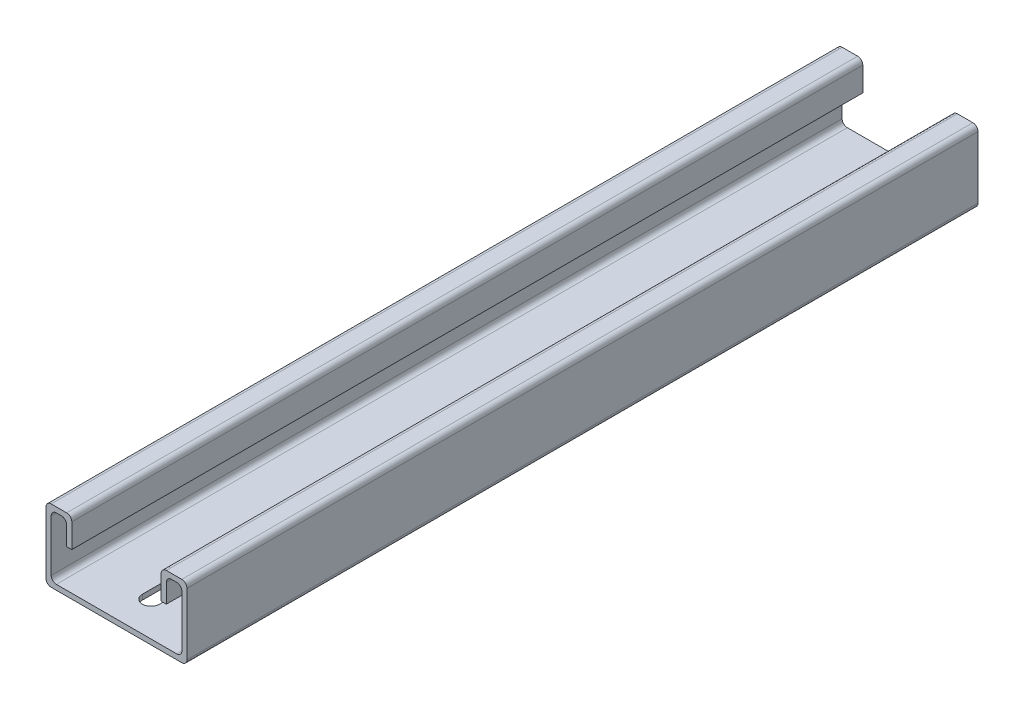
ISO-10303-21;
HEADER;
FILE_DESCRIPTION(('STEP AP214'),'2;1');
FILE_NAME('part.step','',(''),(''),'','','');
FILE_SCHEMA(('AUTOMOTIVE_DESIGN { 1 0 10303 214 1 1 1 1 }'));
ENDSEC;
DATA;
#1=APPLICATION_CONTEXT('core data for automotive mechanical design processes');
#2=APPLICATION_PROTOCOL_DEFINITION('international standard','automotive_design',2000,#1);
#3=PRODUCT_CONTEXT('',#1,'mechanical');
#4=PRODUCT('Part','Part','',(#3));
#5=PRODUCT_RELATED_PRODUCT_CATEGORY('part','',(#4));
#6=PRODUCT_DEFINITION_FORMATION('','',#4);
#7=PRODUCT_DEFINITION_CONTEXT('part definition',#1,'design');
#8=PRODUCT_DEFINITION('design','',#6,#7);
#9=PRODUCT_DEFINITION_SHAPE('','',#8);
#10=(LENGTH_UNIT() NAMED_UNIT(*) SI_UNIT(.MILLI.,.METRE.));
#11=(NAMED_UNIT(*) PLANE_ANGLE_UNIT() SI_UNIT($,.RADIAN.));
#12=(NAMED_UNIT(*) SI_UNIT($,.STERADIAN.) SOLID_ANGLE_UNIT());
#13=UNCERTAINTY_MEASURE_WITH_UNIT(LENGTH_MEASURE(1.E-05),#10,'distance_accuracy_value','');
#14=(GEOMETRIC_REPRESENTATION_CONTEXT(3) GLOBAL_UNCERTAINTY_ASSIGNED_CONTEXT((#13)) GLOBAL_UNIT_ASSIGNED_CONTEXT((#10,
#11,#12)) REPRESENTATION_CONTEXT('',''));
#15=CARTESIAN_POINT('',(0.,0.,0.));
#16=DIRECTION('',(0.,0.,1.));
#17=DIRECTION('',(1.,0.,0.));
#18=AXIS2_PLACEMENT_3D('',#15,#16,#17);
#19=CARTESIAN_POINT('',(19.,-9.,230.));
#20=DIRECTION('',(0.,0.,-1.));
#21=DIRECTION('',(-1.,0.,0.));
#22=AXIS2_PLACEMENT_3D('',#19,#20,#21);
#23=CYLINDRICAL_SURFACE('',#22,1.5);
#24=CARTESIAN_POINT('',(19.,-9.,0.));
#25=DIRECTION('',(0.,0.,1.));
#26=DIRECTION('',(1.,0.,0.));
#27=AXIS2_PLACEMENT_3D('',#24,#25,#26);
#28=CIRCLE('',#27,1.5);
#29=CARTESIAN_POINT('',(19.,-10.5,0.));
#30=VERTEX_POINT('',#29);
#31=CARTESIAN_POINT('',(20.5,-8.99999999999999,0.));
#32=VERTEX_POINT('',#31);
#33=EDGE_CURVE('E466',#30,#32,#28,.T.);
#34=ORIENTED_EDGE('',*,*,#33,.T.);
#35=DIRECTION('',(0.,0.,-1.));
#36=VECTOR('',#35,1.);
#37=CARTESIAN_POINT('',(20.5,-8.99999999999999,230.));
#38=LINE('',#37,#36);
#39=CARTESIAN_POINT('',(20.5,-8.99999999999999,230.));
#40=VERTEX_POINT('',#39);
#41=EDGE_CURVE('E251',#40,#32,#38,.T.);
#42=ORIENTED_EDGE('',*,*,#41,.F.);
#43=CARTESIAN_POINT('',(19.,-9.,230.));
#44=DIRECTION('',(0.,0.,1.));
#45=DIRECTION('',(1.,0.,0.));
#46=AXIS2_PLACEMENT_3D('',#43,#44,#45);
#47=CIRCLE('',#46,1.5);
#48=CARTESIAN_POINT('',(19.,-10.5,230.));
#49=VERTEX_POINT('',#48);
#50=EDGE_CURVE('E387',#49,#40,#47,.T.);
#51=ORIENTED_EDGE('',*,*,#50,.F.);
#52=DIRECTION('',(0.,0.,-1.));
#53=VECTOR('',#52,1.);
#54=CARTESIAN_POINT('',(19.,-10.5,230.));
#55=LINE('',#54,#53);
#56=EDGE_CURVE('E379',#49,#30,#55,.T.);
#57=ORIENTED_EDGE('',*,*,#56,.T.);
#58=EDGE_LOOP('',(#34,#42,#51,#57));
#59=FACE_BOUND('',#58,.T.);
#60=ADVANCED_FACE('F39',(#59),#23,.T.);
#61=CARTESIAN_POINT('',(20.5,-8.99999999999999,230.));
#62=DIRECTION('',(-1.,0.,0.));
#63=DIRECTION('',(0.,0.,1.));
#64=AXIS2_PLACEMENT_3D('',#61,#62,#63);
#65=PLANE('',#64);
#66=DIRECTION('',(0.,1.,0.));
#67=VECTOR('',#66,1.);
#68=CARTESIAN_POINT('',(20.5,-8.99999999999999,0.));
#69=LINE('',#68,#67);
#70=CARTESIAN_POINT('',(20.5,8.99999999999999,0.));
#71=VERTEX_POINT('',#70);
#72=EDGE_CURVE('E463',#32,#71,#69,.T.);
#73=ORIENTED_EDGE('',*,*,#72,.T.);
#74=DIRECTION('',(0.,0.,-1.));
#75=VECTOR('',#74,1.);
#76=CARTESIAN_POINT('',(20.5,8.99999999999999,230.));
#77=LINE('',#76,#75);
#78=CARTESIAN_POINT('',(20.5,8.99999999999999,230.));
#79=VERTEX_POINT('',#78);
#80=EDGE_CURVE('E275',#79,#71,#77,.T.);
#81=ORIENTED_EDGE('',*,*,#80,.F.);
#82=DIRECTION('',(0.,1.,0.));
#83=VECTOR('',#82,1.);
#84=CARTESIAN_POINT('',(20.5,-8.99999999999999,230.));
#85=LINE('',#84,#83);
#86=EDGE_CURVE('E547',#40,#79,#85,.T.);
#87=ORIENTED_EDGE('',*,*,#86,.F.);
#88=ORIENTED_EDGE('',*,*,#41,.T.);
#89=EDGE_LOOP('',(#73,#81,#87,#88));
#90=FACE_BOUND('',#89,.T.);
#91=ADVANCED_FACE('F589',(#90),#65,.F.);
#92=CARTESIAN_POINT('',(19.,9.,230.));
#93=DIRECTION('',(0.,0.,-1.));
#94=DIRECTION('',(-1.,0.,0.));
#95=AXIS2_PLACEMENT_3D('',#92,#93,#94);
#96=CYLINDRICAL_SURFACE('',#95,1.5);
#97=CARTESIAN_POINT('',(19.,9.,0.));
#98=DIRECTION('',(0.,0.,1.));
#99=DIRECTION('',(-1.,0.,0.));
#100=AXIS2_PLACEMENT_3D('',#97,#98,#99);
#101=CIRCLE('',#100,1.5);
#102=CARTESIAN_POINT('',(19.,10.5,0.));
#103=VERTEX_POINT('',#102);
#104=EDGE_CURVE('E460',#71,#103,#101,.T.);
#105=ORIENTED_EDGE('',*,*,#104,.T.);
#106=DIRECTION('',(0.,0.,-1.));
#107=VECTOR('',#106,1.);
#108=CARTESIAN_POINT('',(19.,10.5,230.));
#109=LINE('',#108,#107);
#110=CARTESIAN_POINT('',(19.,10.5,230.));
#111=VERTEX_POINT('',#110);
#112=EDGE_CURVE('E279',#111,#103,#109,.T.);
#113=ORIENTED_EDGE('',*,*,#112,.F.);
#114=CARTESIAN_POINT('',(19.,9.,230.));
#115=DIRECTION('',(0.,0.,1.));
#116=DIRECTION('',(-1.,0.,0.));
#117=AXIS2_PLACEMENT_3D('',#114,#115,#116);
#118=CIRCLE('',#117,1.5);
#119=EDGE_CURVE('E544',#79,#111,#118,.T.);
#120=ORIENTED_EDGE('',*,*,#119,.F.);
#121=ORIENTED_EDGE('',*,*,#80,.T.);
#122=EDGE_LOOP('',(#105,#113,#120,#121));
#123=FACE_BOUND('',#122,.T.);
#124=ADVANCED_FACE('F594',(#123),#96,.T.);
#125=CARTESIAN_POINT('',(19.,10.5,230.));
#126=DIRECTION('',(0.,-1.,0.));
#127=DIRECTION('',(0.,0.,-1.));
#128=AXIS2_PLACEMENT_3D('',#125,#126,#127);
#129=PLANE('',#128);
#130=DIRECTION('',(-1.,0.,0.));
#131=VECTOR('',#130,1.);
#132=CARTESIAN_POINT('',(19.,10.5,0.));
#133=LINE('',#132,#131);
#134=CARTESIAN_POINT('',(14.5,10.5,0.));
#135=VERTEX_POINT('',#134);
#136=EDGE_CURVE('E457',#103,#135,#133,.T.);
#137=ORIENTED_EDGE('',*,*,#136,.T.);
#138=DIRECTION('',(0.,0.,-1.));
#139=VECTOR('',#138,1.);
#140=CARTESIAN_POINT('',(14.5,10.5,230.));
#141=LINE('',#140,#139);
#142=CARTESIAN_POINT('',(14.5,10.5,230.));
#143=VERTEX_POINT('',#142);
#144=EDGE_CURVE('E283',#143,#135,#141,.T.);
#145=ORIENTED_EDGE('',*,*,#144,.F.);
#146=DIRECTION('',(-1.,0.,0.));
#147=VECTOR('',#146,1.);
#148=CARTESIAN_POINT('',(19.,10.5,230.));
#149=LINE('',#148,#147);
#150=EDGE_CURVE('E541',#111,#143,#149,.T.);
#151=ORIENTED_EDGE('',*,*,#150,.F.);
#152=ORIENTED_EDGE('',*,*,#112,.T.);
#153=EDGE_LOOP('',(#137,#145,#151,#152));
#154=FACE_BOUND('',#153,.T.);
#155=ADVANCED_FACE('F725',(#154),#129,.F.);
#156=CARTESIAN_POINT('',(14.5,9.,230.));
#157=DIRECTION('',(0.,0.,-1.));
#158=DIRECTION('',(-1.,0.,0.));
#159=AXIS2_PLACEMENT_3D('',#156,#157,#158);
#160=CYLINDRICAL_SURFACE('',#159,1.5);
#161=CARTESIAN_POINT('',(14.5,9.,0.));
#162=DIRECTION('',(0.,0.,1.));
#163=DIRECTION('',(1.,0.,0.));
#164=AXIS2_PLACEMENT_3D('',#161,#162,#163);
#165=CIRCLE('',#164,1.5);
#166=CARTESIAN_POINT('',(13.,8.99999999999999,0.));
#167=VERTEX_POINT('',#166);
#168=EDGE_CURVE('E454',#135,#167,#165,.T.);
#169=ORIENTED_EDGE('',*,*,#168,.T.);
#170=DIRECTION('',(0.,0.,-1.));
#171=VECTOR('',#170,1.);
#172=CARTESIAN_POINT('',(13.,8.99999999999999,230.));
#173=LINE('',#172,#171);
#174=CARTESIAN_POINT('',(13.,8.99999999999999,230.));
#175=VERTEX_POINT('',#174);
#176=EDGE_CURVE('E287',#175,#167,#173,.T.);
#177=ORIENTED_EDGE('',*,*,#176,.F.);
#178=CARTESIAN_POINT('',(14.5,9.,230.));
#179=DIRECTION('',(0.,0.,1.));
#180=DIRECTION('',(1.,0.,0.));
#181=AXIS2_PLACEMENT_3D('',#178,#179,#180);
#182=CIRCLE('',#181,1.5);
#183=EDGE_CURVE('E538',#143,#175,#182,.T.);
#184=ORIENTED_EDGE('',*,*,#183,.F.);
#185=ORIENTED_EDGE('',*,*,#144,.T.);
#186=EDGE_LOOP('',(#169,#177,#184,#185));
#187=FACE_BOUND('',#186,.T.);
#188=ADVANCED_FACE('F720',(#187),#160,.T.);
#189=CARTESIAN_POINT('',(13.,8.99999999999999,230.));
#190=DIRECTION('',(1.,0.,0.));
#191=DIRECTION('',(0.,0.,-1.));
#192=AXIS2_PLACEMENT_3D('',#189,#190,#191);
#193=PLANE('',#192);
#194=DIRECTION('',(0.,-1.,0.));
#195=VECTOR('',#194,1.);
#196=CARTESIAN_POINT('',(13.,8.99999999999999,0.));
#197=LINE('',#196,#195);
#198=CARTESIAN_POINT('',(13.,2.,0.));
#199=VERTEX_POINT('',#198);
#200=EDGE_CURVE('E451',#167,#199,#197,.T.);
#201=ORIENTED_EDGE('',*,*,#200,.T.);
#202=DIRECTION('',(0.,0.,-1.));
#203=VECTOR('',#202,1.);
#204=CARTESIAN_POINT('',(13.,2.,230.));
#205=LINE('',#204,#203);
#206=CARTESIAN_POINT('',(13.,2.,230.));
#207=VERTEX_POINT('',#206);
#208=EDGE_CURVE('E291',#207,#199,#205,.T.);
#209=ORIENTED_EDGE('',*,*,#208,.F.);
#210=DIRECTION('',(0.,-1.,0.));
#211=VECTOR('',#210,1.);
#212=CARTESIAN_POINT('',(13.,8.99999999999999,230.));
#213=LINE('',#212,#211);
#214=EDGE_CURVE('E535',#175,#207,#213,.T.);
#215=ORIENTED_EDGE('',*,*,#214,.F.);
#216=ORIENTED_EDGE('',*,*,#176,.T.);
#217=EDGE_LOOP('',(#201,#209,#215,#216));
#218=FACE_BOUND('',#217,.T.);
#219=ADVANCED_FACE('F716',(#218),#193,.F.);
#220=CARTESIAN_POINT('',(13.,2.,230.));
#221=DIRECTION('',(0.,1.,0.));
#222=DIRECTION('',(0.,0.,1.));
#223=AXIS2_PLACEMENT_3D('',#220,#221,#222);
#224=PLANE('',#223);
#225=DIRECTION('',(1.,0.,0.));
#226=VECTOR('',#225,1.);
#227=CARTESIAN_POINT('',(13.,2.,0.));
#228=LINE('',#227,#226);
#229=CARTESIAN_POINT('',(14.5,2.,0.));
#230=VERTEX_POINT('',#229);
#231=EDGE_CURVE('E448',#199,#230,#228,.T.);
#232=ORIENTED_EDGE('',*,*,#231,.T.);
#233=DIRECTION('',(0.,0.,-1.));
#234=VECTOR('',#233,1.);
#235=CARTESIAN_POINT('',(14.5,2.,230.));
#236=LINE('',#235,#234);
#237=CARTESIAN_POINT('',(14.5,2.,230.));
#238=VERTEX_POINT('',#237);
#239=EDGE_CURVE('E295',#238,#230,#236,.T.);
#240=ORIENTED_EDGE('',*,*,#239,.F.);
#241=DIRECTION('',(1.,0.,0.));
#242=VECTOR('',#241,1.);
#243=CARTESIAN_POINT('',(13.,2.,230.));
#244=LINE('',#243,#242);
#245=EDGE_CURVE('E532',#207,#238,#244,.T.);
#246=ORIENTED_EDGE('',*,*,#245,.F.);
#247=ORIENTED_EDGE('',*,*,#208,.T.);
#248=EDGE_LOOP('',(#232,#240,#246,#247));
#249=FACE_BOUND('',#248,.T.);
#250=ADVANCED_FACE('F712',(#249),#224,.F.);
#251=CARTESIAN_POINT('',(14.5,7.49999999999999,230.));
#252=DIRECTION('',(-1.,0.,0.));
#253=DIRECTION('',(0.,0.,1.));
#254=AXIS2_PLACEMENT_3D('',#251,#252,#253);
#255=PLANE('',#254);
#256=DIRECTION('',(0.,1.,0.));
#257=VECTOR('',#256,1.);
#258=CARTESIAN_POINT('',(14.5,7.49999999999999,0.));
#259=LINE('',#258,#257);
#260=CARTESIAN_POINT('',(14.5,7.49999999999999,0.));
#261=VERTEX_POINT('',#260);
#262=EDGE_CURVE('E445',#230,#261,#259,.T.);
#263=ORIENTED_EDGE('',*,*,#262,.T.);
#264=DIRECTION('',(0.,0.,-1.));
#265=VECTOR('',#264,1.);
#266=CARTESIAN_POINT('',(14.5,7.49999999999999,230.));
#267=LINE('',#266,#265);
#268=CARTESIAN_POINT('',(14.5,7.49999999999999,230.));
#269=VERTEX_POINT('',#268);
#270=EDGE_CURVE('E299',#269,#261,#267,.T.);
#271=ORIENTED_EDGE('',*,*,#270,.F.);
#272=DIRECTION('',(0.,1.,0.));
#273=VECTOR('',#272,1.);
#274=CARTESIAN_POINT('',(14.5,7.49999999999999,230.));
#275=LINE('',#274,#273);
#276=EDGE_CURVE('E529',#238,#269,#275,.T.);
#277=ORIENTED_EDGE('',*,*,#276,.F.);
#278=ORIENTED_EDGE('',*,*,#239,.T.);
#279=EDGE_LOOP('',(#263,#271,#277,#278));
#280=FACE_BOUND('',#279,.T.);
#281=ADVANCED_FACE('F707',(#280),#255,.F.);
#282=CARTESIAN_POINT('',(16.,7.5,230.));
#283=DIRECTION('',(0.,0.,-1.));
#284=DIRECTION('',(-1.,0.,0.));
#285=AXIS2_PLACEMENT_3D('',#282,#283,#284);
#286=CYLINDRICAL_SURFACE('',#285,1.5);
#287=CARTESIAN_POINT('',(16.,7.5,0.));
#288=DIRECTION('',(0.,0.,-1.));
#289=DIRECTION('',(1.,0.,0.));
#290=AXIS2_PLACEMENT_3D('',#287,#288,#289);
#291=CIRCLE('',#290,1.5);
#292=CARTESIAN_POINT('',(16.,9.,0.));
#293=VERTEX_POINT('',#292);
#294=EDGE_CURVE('E442',#261,#293,#291,.T.);
#295=ORIENTED_EDGE('',*,*,#294,.T.);
#296=DIRECTION('',(0.,0.,-1.));
#297=VECTOR('',#296,1.);
#298=CARTESIAN_POINT('',(16.,9.,230.));
#299=LINE('',#298,#297);
#300=CARTESIAN_POINT('',(16.,9.,230.));
#301=VERTEX_POINT('',#300);
#302=EDGE_CURVE('E303',#301,#293,#299,.T.);
#303=ORIENTED_EDGE('',*,*,#302,.F.);
#304=CARTESIAN_POINT('',(16.,7.5,230.));
#305=DIRECTION('',(0.,0.,-1.));
#306=DIRECTION('',(1.,0.,0.));
#307=AXIS2_PLACEMENT_3D('',#304,#305,#306);
#308=CIRCLE('',#307,1.5);
#309=EDGE_CURVE('E526',#269,#301,#308,.T.);
#310=ORIENTED_EDGE('',*,*,#309,.F.);
#311=ORIENTED_EDGE('',*,*,#270,.T.);
#312=EDGE_LOOP('',(#295,#303,#310,#311));
#313=FACE_BOUND('',#312,.T.);
#314=ADVANCED_FACE('F701',(#313),#286,.F.);
#315=CARTESIAN_POINT('',(17.5,9.,230.));
#316=DIRECTION('',(0.,1.,0.));
#317=DIRECTION('',(0.,0.,1.));
#318=AXIS2_PLACEMENT_3D('',#315,#316,#317);
#319=PLANE('',#318);
#320=DIRECTION('',(1.,0.,0.));
#321=VECTOR('',#320,1.);
#322=CARTESIAN_POINT('',(17.5,9.,0.));
#323=LINE('',#322,#321);
#324=CARTESIAN_POINT('',(17.5,9.,0.));
#325=VERTEX_POINT('',#324);
#326=EDGE_CURVE('E439',#293,#325,#323,.T.);
#327=ORIENTED_EDGE('',*,*,#326,.T.);
#328=DIRECTION('',(0.,0.,-1.));
#329=VECTOR('',#328,1.);
#330=CARTESIAN_POINT('',(17.5,9.,230.));
#331=LINE('',#330,#329);
#332=CARTESIAN_POINT('',(17.5,9.,230.));
#333=VERTEX_POINT('',#332);
#334=EDGE_CURVE('E307',#333,#325,#331,.T.);
#335=ORIENTED_EDGE('',*,*,#334,.F.);
#336=DIRECTION('',(1.,0.,0.));
#337=VECTOR('',#336,1.);
#338=CARTESIAN_POINT('',(17.5,9.,230.));
#339=LINE('',#338,#337);
#340=EDGE_CURVE('E523',#301,#333,#339,.T.);
#341=ORIENTED_EDGE('',*,*,#340,.F.);
#342=ORIENTED_EDGE('',*,*,#302,.T.);
#343=EDGE_LOOP('',(#327,#335,#341,#342));
#344=FACE_BOUND('',#343,.T.);
#345=ADVANCED_FACE('F697',(#344),#319,.F.);
#346=CARTESIAN_POINT('',(17.5,7.5,230.));
#347=DIRECTION('',(0.,0.,-1.));
#348=DIRECTION('',(-1.,0.,0.));
#349=AXIS2_PLACEMENT_3D('',#346,#347,#348);
#350=CYLINDRICAL_SURFACE('',#349,1.5);
#351=CARTESIAN_POINT('',(17.5,7.5,0.));
#352=DIRECTION('',(0.,0.,-1.));
#353=DIRECTION('',(1.,0.,0.));
#354=AXIS2_PLACEMENT_3D('',#351,#352,#353);
#355=CIRCLE('',#354,1.5);
#356=CARTESIAN_POINT('',(19.,7.49999999999999,0.));
#357=VERTEX_POINT('',#356);
#358=EDGE_CURVE('E436',#325,#357,#355,.T.);
#359=ORIENTED_EDGE('',*,*,#358,.T.);
#360=DIRECTION('',(0.,0.,-1.));
#361=VECTOR('',#360,1.);
#362=CARTESIAN_POINT('',(19.,7.49999999999999,230.));
#363=LINE('',#362,#361);
#364=CARTESIAN_POINT('',(19.,7.49999999999999,230.));
#365=VERTEX_POINT('',#364);
#366=EDGE_CURVE('E311',#365,#357,#363,.T.);
#367=ORIENTED_EDGE('',*,*,#366,.F.);
#368=CARTESIAN_POINT('',(17.5,7.5,230.));
#369=DIRECTION('',(0.,0.,-1.));
#370=DIRECTION('',(1.,0.,0.));
#371=AXIS2_PLACEMENT_3D('',#368,#369,#370);
#372=CIRCLE('',#371,1.5);
#373=EDGE_CURVE('E520',#333,#365,#372,.T.);
#374=ORIENTED_EDGE('',*,*,#373,.F.);
#375=ORIENTED_EDGE('',*,*,#334,.T.);
#376=EDGE_LOOP('',(#359,#367,#374,#375));
#377=FACE_BOUND('',#376,.T.);
#378=ADVANCED_FACE('F692',(#377),#350,.F.);
#379=CARTESIAN_POINT('',(19.,-7.49999999999999,230.));
#380=DIRECTION('',(1.,0.,0.));
#381=DIRECTION('',(0.,0.,-1.));
#382=AXIS2_PLACEMENT_3D('',#379,#380,#381);
#383=PLANE('',#382);
#384=DIRECTION('',(0.,-1.,0.));
#385=VECTOR('',#384,1.);
#386=CARTESIAN_POINT('',(19.,-7.49999999999999,0.));
#387=LINE('',#386,#385);
#388=CARTESIAN_POINT('',(19.,-7.5,0.));
#389=VERTEX_POINT('',#388);
#390=EDGE_CURVE('E433',#357,#389,#387,.T.);
#391=ORIENTED_EDGE('',*,*,#390,.T.);
#392=DIRECTION('',(0.,0.,-1.));
#393=VECTOR('',#392,1.);
#394=CARTESIAN_POINT('',(19.,-7.5,230.));
#395=LINE('',#394,#393);
#396=CARTESIAN_POINT('',(19.,-7.5,230.));
#397=VERTEX_POINT('',#396);
#398=EDGE_CURVE('E315',#397,#389,#395,.T.);
#399=ORIENTED_EDGE('',*,*,#398,.F.);
#400=DIRECTION('',(0.,-1.,0.));
#401=VECTOR('',#400,1.);
#402=CARTESIAN_POINT('',(19.,-7.49999999999999,230.));
#403=LINE('',#402,#401);
#404=EDGE_CURVE('E517',#365,#397,#403,.T.);
#405=ORIENTED_EDGE('',*,*,#404,.F.);
#406=ORIENTED_EDGE('',*,*,#366,.T.);
#407=EDGE_LOOP('',(#391,#399,#405,#406));
#408=FACE_BOUND('',#407,.T.);
#409=ADVANCED_FACE('F686',(#408),#383,.F.);
#410=CARTESIAN_POINT('',(17.5,-7.5,230.));
#411=DIRECTION('',(0.,0.,-1.));
#412=DIRECTION('',(-1.,0.,0.));
#413=AXIS2_PLACEMENT_3D('',#410,#411,#412);
#414=CYLINDRICAL_SURFACE('',#413,1.5);
#415=CARTESIAN_POINT('',(17.5,-7.5,0.));
#416=DIRECTION('',(0.,0.,-1.));
#417=DIRECTION('',(1.,0.,0.));
#418=AXIS2_PLACEMENT_3D('',#415,#416,#417);
#419=CIRCLE('',#418,1.5);
#420=CARTESIAN_POINT('',(17.5,-9.,0.));
#421=VERTEX_POINT('',#420);
#422=EDGE_CURVE('E430',#389,#421,#419,.T.);
#423=ORIENTED_EDGE('',*,*,#422,.T.);
#424=DIRECTION('',(0.,0.,-1.));
#425=VECTOR('',#424,1.);
#426=CARTESIAN_POINT('',(17.5,-9.,230.));
#427=LINE('',#426,#425);
#428=CARTESIAN_POINT('',(17.5,-9.,230.));
#429=VERTEX_POINT('',#428);
#430=EDGE_CURVE('E319',#429,#421,#427,.T.);
#431=ORIENTED_EDGE('',*,*,#430,.F.);
#432=CARTESIAN_POINT('',(17.5,-7.5,230.));
#433=DIRECTION('',(0.,0.,-1.));
#434=DIRECTION('',(1.,0.,0.));
#435=AXIS2_PLACEMENT_3D('',#432,#433,#434);
#436=CIRCLE('',#435,1.5);
#437=EDGE_CURVE('E514',#397,#429,#436,.T.);
#438=ORIENTED_EDGE('',*,*,#437,.F.);
#439=ORIENTED_EDGE('',*,*,#398,.T.);
#440=EDGE_LOOP('',(#423,#431,#438,#439));
#441=FACE_BOUND('',#440,.T.);
#442=ADVANCED_FACE('F682',(#441),#414,.F.);
#443=CARTESIAN_POINT('',(-17.5,-9.,230.));
#444=DIRECTION('',(0.,-1.,0.));
#445=DIRECTION('',(0.,0.,-1.));
#446=AXIS2_PLACEMENT_3D('',#443,#444,#445);
#447=PLANE('',#446);
#448=DIRECTION('',(0.,0.,-1.));
#449=VECTOR('',#448,1.);
#450=CARTESIAN_POINT('',(-2.5,-9.,230.));
#451=LINE('',#450,#449);
#452=CARTESIAN_POINT('',(-2.5,-9.00000000000001,220.));
#453=VERTEX_POINT('',#452);
#454=CARTESIAN_POINT('',(-2.49999999999998,-9.,10.));
#455=VERTEX_POINT('',#454);
#456=EDGE_CURVE('E562',#453,#455,#451,.T.);
#457=ORIENTED_EDGE('',*,*,#456,.T.);
#458=CARTESIAN_POINT('',(0.,-9.00000000000001,10.));
#459=DIRECTION('',(0.,-1.,0.));
#460=DIRECTION('',(0.,0.,-1.));
#461=AXIS2_PLACEMENT_3D('',#458,#459,#460);
#462=CIRCLE('',#461,2.49999999999999);
#463=CARTESIAN_POINT('',(2.49999999999999,-9.00000000000001,10.));
#464=VERTEX_POINT('',#463);
#465=EDGE_CURVE('E258',#455,#464,#462,.T.);
#466=ORIENTED_EDGE('',*,*,#465,.T.);
#467=DIRECTION('',(0.,0.,-1.));
#468=VECTOR('',#467,1.);
#469=CARTESIAN_POINT('',(2.5,-9.,230.));
#470=LINE('',#469,#468);
#471=CARTESIAN_POINT('',(2.5,-9.00000000000001,220.));
#472=VERTEX_POINT('',#471);
#473=EDGE_CURVE('E555',#472,#464,#470,.T.);
#474=ORIENTED_EDGE('',*,*,#473,.F.);
#475=CARTESIAN_POINT('',(0.,-9.00000000000001,220.));
#476=DIRECTION('',(0.,-1.,0.));
#477=DIRECTION('',(0.,0.,-1.));
#478=AXIS2_PLACEMENT_3D('',#475,#476,#477);
#479=CIRCLE('',#478,2.5);
#480=EDGE_CURVE('E558',#472,#453,#479,.T.);
#481=ORIENTED_EDGE('',*,*,#480,.T.);
#482=EDGE_LOOP('',(#457,#466,#474,#481));
#483=FACE_BOUND('',#482,.T.);
#484=DIRECTION('',(-1.,0.,0.));
#485=VECTOR('',#484,1.);
#486=CARTESIAN_POINT('',(-17.5,-9.,0.));
#487=LINE('',#486,#485);
#488=CARTESIAN_POINT('',(-17.5,-9.,0.));
#489=VERTEX_POINT('',#488);
#490=EDGE_CURVE('E427',#421,#489,#487,.T.);
#491=ORIENTED_EDGE('',*,*,#490,.T.);
#492=DIRECTION('',(0.,0.,-1.));
#493=VECTOR('',#492,1.);
#494=CARTESIAN_POINT('',(-17.5,-9.,230.));
#495=LINE('',#494,#493);
#496=CARTESIAN_POINT('',(-17.5,-9.,230.));
#497=VERTEX_POINT('',#496);
#498=EDGE_CURVE('E323',#497,#489,#495,.T.);
#499=ORIENTED_EDGE('',*,*,#498,.F.);
#500=DIRECTION('',(-1.,0.,0.));
#501=VECTOR('',#500,1.);
#502=CARTESIAN_POINT('',(-17.5,-9.,230.));
#503=LINE('',#502,#501);
#504=EDGE_CURVE('E511',#429,#497,#503,.T.);
#505=ORIENTED_EDGE('',*,*,#504,.F.);
#506=ORIENTED_EDGE('',*,*,#430,.T.);
#507=EDGE_LOOP('',(#491,#499,#505,#506));
#508=FACE_BOUND('',#507,.T.);
#509=ADVANCED_FACE('F574',(#483,#508),#447,.F.);
#510=CARTESIAN_POINT('',(-17.5,-7.5,230.));
#511=DIRECTION('',(0.,0.,-1.));
#512=DIRECTION('',(-1.,0.,0.));
#513=AXIS2_PLACEMENT_3D('',#510,#511,#512);
#514=CYLINDRICAL_SURFACE('',#513,1.5);
#515=CARTESIAN_POINT('',(-17.5,-7.5,0.));
#516=DIRECTION('',(0.,0.,-1.));
#517=DIRECTION('',(1.,0.,0.));
#518=AXIS2_PLACEMENT_3D('',#515,#516,#517);
#519=CIRCLE('',#518,1.5);
#520=CARTESIAN_POINT('',(-19.,-7.49999999999999,0.));
#521=VERTEX_POINT('',#520);
#522=EDGE_CURVE('E424',#489,#521,#519,.T.);
#523=ORIENTED_EDGE('',*,*,#522,.T.);
#524=DIRECTION('',(0.,0.,-1.));
#525=VECTOR('',#524,1.);
#526=CARTESIAN_POINT('',(-19.,-7.49999999999999,230.));
#527=LINE('',#526,#525);
#528=CARTESIAN_POINT('',(-19.,-7.49999999999999,230.));
#529=VERTEX_POINT('',#528);
#530=EDGE_CURVE('E327',#529,#521,#527,.T.);
#531=ORIENTED_EDGE('',*,*,#530,.F.);
#532=CARTESIAN_POINT('',(-17.5,-7.5,230.));
#533=DIRECTION('',(0.,0.,-1.));
#534=DIRECTION('',(1.,0.,0.));
#535=AXIS2_PLACEMENT_3D('',#532,#533,#534);
#536=CIRCLE('',#535,1.5);
#537=EDGE_CURVE('E508',#497,#529,#536,.T.);
#538=ORIENTED_EDGE('',*,*,#537,.F.);
#539=ORIENTED_EDGE('',*,*,#498,.T.);
#540=EDGE_LOOP('',(#523,#531,#538,#539));
#541=FACE_BOUND('',#540,.T.);
#542=ADVANCED_FACE('F673',(#541),#514,.F.);
#543=CARTESIAN_POINT('',(-19.,7.49999999999999,230.));
#544=DIRECTION('',(-1.,0.,0.));
#545=DIRECTION('',(0.,0.,1.));
#546=AXIS2_PLACEMENT_3D('',#543,#544,#545);
#547=PLANE('',#546);
#548=DIRECTION('',(0.,1.,0.));
#549=VECTOR('',#548,1.);
#550=CARTESIAN_POINT('',(-19.,7.49999999999999,0.));
#551=LINE('',#550,#549);
#552=CARTESIAN_POINT('',(-19.,7.49999999999999,0.));
#553=VERTEX_POINT('',#552);
#554=EDGE_CURVE('E421',#521,#553,#551,.T.);
#555=ORIENTED_EDGE('',*,*,#554,.T.);
#556=DIRECTION('',(0.,0.,-1.));
#557=VECTOR('',#556,1.);
#558=CARTESIAN_POINT('',(-19.,7.49999999999999,230.));
#559=LINE('',#558,#557);
#560=CARTESIAN_POINT('',(-19.,7.49999999999999,230.));
#561=VERTEX_POINT('',#560);
#562=EDGE_CURVE('E331',#561,#553,#559,.T.);
#563=ORIENTED_EDGE('',*,*,#562,.F.);
#564=DIRECTION('',(0.,1.,0.));
#565=VECTOR('',#564,1.);
#566=CARTESIAN_POINT('',(-19.,7.49999999999999,230.));
#567=LINE('',#566,#565);
#568=EDGE_CURVE('E505',#529,#561,#567,.T.);
#569=ORIENTED_EDGE('',*,*,#568,.F.);
#570=ORIENTED_EDGE('',*,*,#530,.T.);
#571=EDGE_LOOP('',(#555,#563,#569,#570));
#572=FACE_BOUND('',#571,.T.);
#573=ADVANCED_FACE('F669',(#572),#547,.F.);
#574=CARTESIAN_POINT('',(-17.5,7.5,230.));
#575=DIRECTION('',(0.,0.,-1.));
#576=DIRECTION('',(-1.,0.,0.));
#577=AXIS2_PLACEMENT_3D('',#574,#575,#576);
#578=CYLINDRICAL_SURFACE('',#577,1.5);
#579=CARTESIAN_POINT('',(-17.5,7.5,0.));
#580=DIRECTION('',(0.,0.,-1.));
#581=DIRECTION('',(1.,0.,0.));
#582=AXIS2_PLACEMENT_3D('',#579,#580,#581);
#583=CIRCLE('',#582,1.5);
#584=CARTESIAN_POINT('',(-17.5,9.,0.));
#585=VERTEX_POINT('',#584);
#586=EDGE_CURVE('E418',#553,#585,#583,.T.);
#587=ORIENTED_EDGE('',*,*,#586,.T.);
#588=DIRECTION('',(0.,0.,-1.));
#589=VECTOR('',#588,1.);
#590=CARTESIAN_POINT('',(-17.5,9.,230.));
#591=LINE('',#590,#589);
#592=CARTESIAN_POINT('',(-17.5,9.,230.));
#593=VERTEX_POINT('',#592);
#594=EDGE_CURVE('E335',#593,#585,#591,.T.);
#595=ORIENTED_EDGE('',*,*,#594,.F.);
#596=CARTESIAN_POINT('',(-17.5,7.5,230.));
#597=DIRECTION('',(0.,0.,-1.));
#598=DIRECTION('',(1.,0.,0.));
#599=AXIS2_PLACEMENT_3D('',#596,#597,#598);
#600=CIRCLE('',#599,1.5);
#601=EDGE_CURVE('E502',#561,#593,#600,.T.);
#602=ORIENTED_EDGE('',*,*,#601,.F.);
#603=ORIENTED_EDGE('',*,*,#562,.T.);
#604=EDGE_LOOP('',(#587,#595,#602,#603));
#605=FACE_BOUND('',#604,.T.);
#606=ADVANCED_FACE('F664',(#605),#578,.F.);
#607=CARTESIAN_POINT('',(-16.,9.,230.));
#608=DIRECTION('',(0.,1.,0.));
#609=DIRECTION('',(0.,0.,1.));
#610=AXIS2_PLACEMENT_3D('',#607,#608,#609);
#611=PLANE('',#610);
#612=DIRECTION('',(1.,0.,0.));
#613=VECTOR('',#612,1.);
#614=CARTESIAN_POINT('',(-16.,9.,0.));
#615=LINE('',#614,#613);
#616=CARTESIAN_POINT('',(-16.,9.,0.));
#617=VERTEX_POINT('',#616);
#618=EDGE_CURVE('E415',#585,#617,#615,.T.);
#619=ORIENTED_EDGE('',*,*,#618,.T.);
#620=DIRECTION('',(0.,0.,-1.));
#621=VECTOR('',#620,1.);
#622=CARTESIAN_POINT('',(-16.,9.,230.));
#623=LINE('',#622,#621);
#624=CARTESIAN_POINT('',(-16.,9.,230.));
#625=VERTEX_POINT('',#624);
#626=EDGE_CURVE('E339',#625,#617,#623,.T.);
#627=ORIENTED_EDGE('',*,*,#626,.F.);
#628=DIRECTION('',(1.,0.,0.));
#629=VECTOR('',#628,1.);
#630=CARTESIAN_POINT('',(-16.,9.,230.));
#631=LINE('',#630,#629);
#632=EDGE_CURVE('E499',#593,#625,#631,.T.);
#633=ORIENTED_EDGE('',*,*,#632,.F.);
#634=ORIENTED_EDGE('',*,*,#594,.T.);
#635=EDGE_LOOP('',(#619,#627,#633,#634));
#636=FACE_BOUND('',#635,.T.);
#637=ADVANCED_FACE('F658',(#636),#611,.F.);
#638=CARTESIAN_POINT('',(-16.,7.5,230.));
#639=DIRECTION('',(0.,0.,-1.));
#640=DIRECTION('',(-1.,0.,0.));
#641=AXIS2_PLACEMENT_3D('',#638,#639,#640);
#642=CYLINDRICAL_SURFACE('',#641,1.5);
#643=CARTESIAN_POINT('',(-16.,7.5,0.));
#644=DIRECTION('',(0.,0.,-1.));
#645=DIRECTION('',(1.,0.,0.));
#646=AXIS2_PLACEMENT_3D('',#643,#644,#645);
#647=CIRCLE('',#646,1.5);
#648=CARTESIAN_POINT('',(-14.5,7.49999999999999,0.));
#649=VERTEX_POINT('',#648);
#650=EDGE_CURVE('E412',#617,#649,#647,.T.);
#651=ORIENTED_EDGE('',*,*,#650,.T.);
#652=DIRECTION('',(0.,0.,-1.));
#653=VECTOR('',#652,1.);
#654=CARTESIAN_POINT('',(-14.5,7.49999999999999,230.));
#655=LINE('',#654,#653);
#656=CARTESIAN_POINT('',(-14.5,7.49999999999999,230.));
#657=VERTEX_POINT('',#656);
#658=EDGE_CURVE('E343',#657,#649,#655,.T.);
#659=ORIENTED_EDGE('',*,*,#658,.F.);
#660=CARTESIAN_POINT('',(-16.,7.5,230.));
#661=DIRECTION('',(0.,0.,-1.));
#662=DIRECTION('',(1.,0.,0.));
#663=AXIS2_PLACEMENT_3D('',#660,#661,#662);
#664=CIRCLE('',#663,1.5);
#665=EDGE_CURVE('E496',#625,#657,#664,.T.);
#666=ORIENTED_EDGE('',*,*,#665,.F.);
#667=ORIENTED_EDGE('',*,*,#626,.T.);
#668=EDGE_LOOP('',(#651,#659,#666,#667));
#669=FACE_BOUND('',#668,.T.);
#670=ADVANCED_FACE('F654',(#669),#642,.F.);
#671=CARTESIAN_POINT('',(-14.5,2.,230.));
#672=DIRECTION('',(1.,0.,0.));
#673=DIRECTION('',(0.,0.,-1.));
#674=AXIS2_PLACEMENT_3D('',#671,#672,#673);
#675=PLANE('',#674);
#676=DIRECTION('',(0.,-1.,0.));
#677=VECTOR('',#676,1.);
#678=CARTESIAN_POINT('',(-14.5,2.,0.));
#679=LINE('',#678,#677);
#680=CARTESIAN_POINT('',(-14.5,2.,0.));
#681=VERTEX_POINT('',#680);
#682=EDGE_CURVE('E409',#649,#681,#679,.T.);
#683=ORIENTED_EDGE('',*,*,#682,.T.);
#684=DIRECTION('',(0.,0.,-1.));
#685=VECTOR('',#684,1.);
#686=CARTESIAN_POINT('',(-14.5,2.,230.));
#687=LINE('',#686,#685);
#688=CARTESIAN_POINT('',(-14.5,2.,230.));
#689=VERTEX_POINT('',#688);
#690=EDGE_CURVE('E347',#689,#681,#687,.T.);
#691=ORIENTED_EDGE('',*,*,#690,.F.);
#692=DIRECTION('',(0.,-1.,0.));
#693=VECTOR('',#692,1.);
#694=CARTESIAN_POINT('',(-14.5,2.,230.));
#695=LINE('',#694,#693);
#696=EDGE_CURVE('E493',#657,#689,#695,.T.);
#697=ORIENTED_EDGE('',*,*,#696,.F.);
#698=ORIENTED_EDGE('',*,*,#658,.T.);
#699=EDGE_LOOP('',(#683,#691,#697,#698));
#700=FACE_BOUND('',#699,.T.);
#701=ADVANCED_FACE('F649',(#700),#675,.F.);
#702=CARTESIAN_POINT('',(-13.,2.,230.));
#703=DIRECTION('',(0.,1.,0.));
#704=DIRECTION('',(-1.,0.,0.));
#705=AXIS2_PLACEMENT_3D('',#702,#703,#704);
#706=PLANE('',#705);
#707=DIRECTION('',(1.,0.,0.));
#708=VECTOR('',#707,1.);
#709=CARTESIAN_POINT('',(-13.,2.,0.));
#710=LINE('',#709,#708);
#711=CARTESIAN_POINT('',(-13.,2.,0.));
#712=VERTEX_POINT('',#711);
#713=EDGE_CURVE('E406',#681,#712,#710,.T.);
#714=ORIENTED_EDGE('',*,*,#713,.T.);
#715=DIRECTION('',(0.,0.,-1.));
#716=VECTOR('',#715,1.);
#717=CARTESIAN_POINT('',(-13.,2.,230.));
#718=LINE('',#717,#716);
#719=CARTESIAN_POINT('',(-13.,2.,230.));
#720=VERTEX_POINT('',#719);
#721=EDGE_CURVE('E351',#720,#712,#718,.T.);
#722=ORIENTED_EDGE('',*,*,#721,.F.);
#723=DIRECTION('',(1.,0.,0.));
#724=VECTOR('',#723,1.);
#725=CARTESIAN_POINT('',(-13.,2.,230.));
#726=LINE('',#725,#724);
#727=EDGE_CURVE('E490',#689,#720,#726,.T.);
#728=ORIENTED_EDGE('',*,*,#727,.F.);
#729=ORIENTED_EDGE('',*,*,#690,.T.);
#730=EDGE_LOOP('',(#714,#722,#728,#729));
#731=FACE_BOUND('',#730,.T.);
#732=ADVANCED_FACE('F643',(#731),#706,.F.);
#733=CARTESIAN_POINT('',(-13.,8.99999999999999,230.));
#734=DIRECTION('',(-1.,0.,0.));
#735=DIRECTION('',(0.,0.,1.));
#736=AXIS2_PLACEMENT_3D('',#733,#734,#735);
#737=PLANE('',#736);
#738=DIRECTION('',(0.,1.,0.));
#739=VECTOR('',#738,1.);
#740=CARTESIAN_POINT('',(-13.,8.99999999999999,0.));
#741=LINE('',#740,#739);
#742=CARTESIAN_POINT('',(-13.,8.99999999999999,0.));
#743=VERTEX_POINT('',#742);
#744=EDGE_CURVE('E403',#712,#743,#741,.T.);
#745=ORIENTED_EDGE('',*,*,#744,.T.);
#746=DIRECTION('',(0.,0.,-1.));
#747=VECTOR('',#746,1.);
#748=CARTESIAN_POINT('',(-13.,8.99999999999999,230.));
#749=LINE('',#748,#747);
#750=CARTESIAN_POINT('',(-13.,8.99999999999999,230.));
#751=VERTEX_POINT('',#750);
#752=EDGE_CURVE('E355',#751,#743,#749,.T.);
#753=ORIENTED_EDGE('',*,*,#752,.F.);
#754=DIRECTION('',(0.,1.,0.));
#755=VECTOR('',#754,1.);
#756=CARTESIAN_POINT('',(-13.,8.99999999999999,230.));
#757=LINE('',#756,#755);
#758=EDGE_CURVE('E487',#720,#751,#757,.T.);
#759=ORIENTED_EDGE('',*,*,#758,.F.);
#760=ORIENTED_EDGE('',*,*,#721,.T.);
#761=EDGE_LOOP('',(#745,#753,#759,#760));
#762=FACE_BOUND('',#761,.T.);
#763=ADVANCED_FACE('F639',(#762),#737,.F.);
#764=CARTESIAN_POINT('',(-14.5,9.,230.));
#765=DIRECTION('',(0.,0.,-1.));
#766=DIRECTION('',(-1.,0.,0.));
#767=AXIS2_PLACEMENT_3D('',#764,#765,#766);
#768=CYLINDRICAL_SURFACE('',#767,1.5);
#769=CARTESIAN_POINT('',(-14.5,9.,0.));
#770=DIRECTION('',(0.,0.,1.));
#771=DIRECTION('',(-1.,0.,0.));
#772=AXIS2_PLACEMENT_3D('',#769,#770,#771);
#773=CIRCLE('',#772,1.5);
#774=CARTESIAN_POINT('',(-14.5,10.5,0.));
#775=VERTEX_POINT('',#774);
#776=EDGE_CURVE('E400',#743,#775,#773,.T.);
#777=ORIENTED_EDGE('',*,*,#776,.T.);
#778=DIRECTION('',(0.,0.,-1.));
#779=VECTOR('',#778,1.);
#780=CARTESIAN_POINT('',(-14.5,10.5,230.));
#781=LINE('',#780,#779);
#782=CARTESIAN_POINT('',(-14.5,10.5,230.));
#783=VERTEX_POINT('',#782);
#784=EDGE_CURVE('E359',#783,#775,#781,.T.);
#785=ORIENTED_EDGE('',*,*,#784,.F.);
#786=CARTESIAN_POINT('',(-14.5,9.,230.));
#787=DIRECTION('',(0.,0.,1.));
#788=DIRECTION('',(-1.,0.,0.));
#789=AXIS2_PLACEMENT_3D('',#786,#787,#788);
#790=CIRCLE('',#789,1.5);
#791=EDGE_CURVE('E484',#751,#783,#790,.T.);
#792=ORIENTED_EDGE('',*,*,#791,.F.);
#793=ORIENTED_EDGE('',*,*,#752,.T.);
#794=EDGE_LOOP('',(#777,#785,#792,#793));
#795=FACE_BOUND('',#794,.T.);
#796=ADVANCED_FACE('F634',(#795),#768,.T.);
#797=CARTESIAN_POINT('',(-19.,10.5,230.));
#798=DIRECTION('',(0.,-1.,0.));
#799=DIRECTION('',(0.,0.,-1.));
#800=AXIS2_PLACEMENT_3D('',#797,#798,#799);
#801=PLANE('',#800);
#802=DIRECTION('',(-1.,0.,0.));
#803=VECTOR('',#802,1.);
#804=CARTESIAN_POINT('',(-19.,10.5,0.));
#805=LINE('',#804,#803);
#806=CARTESIAN_POINT('',(-19.,10.5,0.));
#807=VERTEX_POINT('',#806);
#808=EDGE_CURVE('E397',#775,#807,#805,.T.);
#809=ORIENTED_EDGE('',*,*,#808,.T.);
#810=DIRECTION('',(0.,0.,-1.));
#811=VECTOR('',#810,1.);
#812=CARTESIAN_POINT('',(-19.,10.5,230.));
#813=LINE('',#812,#811);
#814=CARTESIAN_POINT('',(-19.,10.5,230.));
#815=VERTEX_POINT('',#814);
#816=EDGE_CURVE('E363',#815,#807,#813,.T.);
#817=ORIENTED_EDGE('',*,*,#816,.F.);
#818=DIRECTION('',(-1.,0.,0.));
#819=VECTOR('',#818,1.);
#820=CARTESIAN_POINT('',(-19.,10.5,230.));
#821=LINE('',#820,#819);
#822=EDGE_CURVE('E481',#783,#815,#821,.T.);
#823=ORIENTED_EDGE('',*,*,#822,.F.);
#824=ORIENTED_EDGE('',*,*,#784,.T.);
#825=EDGE_LOOP('',(#809,#817,#823,#824));
#826=FACE_BOUND('',#825,.T.);
#827=ADVANCED_FACE('F628',(#826),#801,.F.);
#828=CARTESIAN_POINT('',(-19.,9.,230.));
#829=DIRECTION('',(0.,0.,-1.));
#830=DIRECTION('',(-1.,0.,0.));
#831=AXIS2_PLACEMENT_3D('',#828,#829,#830);
#832=CYLINDRICAL_SURFACE('',#831,1.5);
#833=CARTESIAN_POINT('',(-19.,9.,0.));
#834=DIRECTION('',(0.,0.,1.));
#835=DIRECTION('',(-1.,0.,0.));
#836=AXIS2_PLACEMENT_3D('',#833,#834,#835);
#837=CIRCLE('',#836,1.5);
#838=CARTESIAN_POINT('',(-20.5,8.99999999999999,0.));
#839=VERTEX_POINT('',#838);
#840=EDGE_CURVE('E394',#807,#839,#837,.T.);
#841=ORIENTED_EDGE('',*,*,#840,.T.);
#842=DIRECTION('',(0.,0.,-1.));
#843=VECTOR('',#842,1.);
#844=CARTESIAN_POINT('',(-20.5,8.99999999999999,230.));
#845=LINE('',#844,#843);
#846=CARTESIAN_POINT('',(-20.5,8.99999999999999,230.));
#847=VERTEX_POINT('',#846);
#848=EDGE_CURVE('E367',#847,#839,#845,.T.);
#849=ORIENTED_EDGE('',*,*,#848,.F.);
#850=CARTESIAN_POINT('',(-19.,9.,230.));
#851=DIRECTION('',(0.,0.,1.));
#852=DIRECTION('',(-1.,0.,0.));
#853=AXIS2_PLACEMENT_3D('',#850,#851,#852);
#854=CIRCLE('',#853,1.5);
#855=EDGE_CURVE('E478',#815,#847,#854,.T.);
#856=ORIENTED_EDGE('',*,*,#855,.F.);
#857=ORIENTED_EDGE('',*,*,#816,.T.);
#858=EDGE_LOOP('',(#841,#849,#856,#857));
#859=FACE_BOUND('',#858,.T.);
#860=ADVANCED_FACE('F624',(#859),#832,.T.);
#861=CARTESIAN_POINT('',(-20.5,-8.99999999999999,230.));
#862=DIRECTION('',(1.,0.,0.));
#863=DIRECTION('',(0.,0.,-1.));
#864=AXIS2_PLACEMENT_3D('',#861,#862,#863);
#865=PLANE('',#864);
#866=DIRECTION('',(0.,-1.,0.));
#867=VECTOR('',#866,1.);
#868=CARTESIAN_POINT('',(-20.5,-8.99999999999999,0.));
#869=LINE('',#868,#867);
#870=CARTESIAN_POINT('',(-20.5,-9.,0.));
#871=VERTEX_POINT('',#870);
#872=EDGE_CURVE('E391',#839,#871,#869,.T.);
#873=ORIENTED_EDGE('',*,*,#872,.T.);
#874=DIRECTION('',(0.,0.,-1.));
#875=VECTOR('',#874,1.);
#876=CARTESIAN_POINT('',(-20.5,-9.,230.));
#877=LINE('',#876,#875);
#878=CARTESIAN_POINT('',(-20.5,-9.,230.));
#879=VERTEX_POINT('',#878);
#880=EDGE_CURVE('E371',#879,#871,#877,.T.);
#881=ORIENTED_EDGE('',*,*,#880,.F.);
#882=DIRECTION('',(0.,-1.,0.));
#883=VECTOR('',#882,1.);
#884=CARTESIAN_POINT('',(-20.5,-8.99999999999999,230.));
#885=LINE('',#884,#883);
#886=EDGE_CURVE('E475',#847,#879,#885,.T.);
#887=ORIENTED_EDGE('',*,*,#886,.F.);
#888=ORIENTED_EDGE('',*,*,#848,.T.);
#889=EDGE_LOOP('',(#873,#881,#887,#888));
#890=FACE_BOUND('',#889,.T.);
#891=ADVANCED_FACE('F619',(#890),#865,.F.);
#892=CARTESIAN_POINT('',(-19.,-9.,230.));
#893=DIRECTION('',(0.,0.,-1.));
#894=DIRECTION('',(-1.,0.,0.));
#895=AXIS2_PLACEMENT_3D('',#892,#893,#894);
#896=CYLINDRICAL_SURFACE('',#895,1.5);
#897=CARTESIAN_POINT('',(-19.,-9.,0.));
#898=DIRECTION('',(0.,0.,1.));
#899=DIRECTION('',(-1.,0.,0.));
#900=AXIS2_PLACEMENT_3D('',#897,#898,#899);
#901=CIRCLE('',#900,1.5);
#902=CARTESIAN_POINT('',(-19.,-10.5,0.));
#903=VERTEX_POINT('',#902);
#904=EDGE_CURVE('E388',#871,#903,#901,.T.);
#905=ORIENTED_EDGE('',*,*,#904,.T.);
#906=DIRECTION('',(0.,0.,-1.));
#907=VECTOR('',#906,1.);
#908=CARTESIAN_POINT('',(-19.,-10.5,230.));
#909=LINE('',#908,#907);
#910=CARTESIAN_POINT('',(-19.,-10.5,230.));
#911=VERTEX_POINT('',#910);
#912=EDGE_CURVE('E375',#911,#903,#909,.T.);
#913=ORIENTED_EDGE('',*,*,#912,.F.);
#914=CARTESIAN_POINT('',(-19.,-9.,230.));
#915=DIRECTION('',(0.,0.,1.));
#916=DIRECTION('',(-1.,0.,0.));
#917=AXIS2_PLACEMENT_3D('',#914,#915,#916);
#918=CIRCLE('',#917,1.5);
#919=EDGE_CURVE('E472',#879,#911,#918,.T.);
#920=ORIENTED_EDGE('',*,*,#919,.F.);
#921=ORIENTED_EDGE('',*,*,#880,.T.);
#922=EDGE_LOOP('',(#905,#913,#920,#921));
#923=FACE_BOUND('',#922,.T.);
#924=ADVANCED_FACE('F613',(#923),#896,.T.);
#925=CARTESIAN_POINT('',(-19.,-10.5,230.));
#926=DIRECTION('',(0.,1.,0.));
#927=DIRECTION('',(0.,0.,1.));
#928=AXIS2_PLACEMENT_3D('',#925,#926,#927);
#929=PLANE('',#928);
#930=DIRECTION('',(0.,0.,1.));
#931=VECTOR('',#930,1.);
#932=CARTESIAN_POINT('',(2.5,-10.5,230.));
#933=LINE('',#932,#931);
#934=CARTESIAN_POINT('',(2.49999999999999,-10.5,10.));
#935=VERTEX_POINT('',#934);
#936=CARTESIAN_POINT('',(2.5,-10.5,220.));
#937=VERTEX_POINT('',#936);
#938=EDGE_CURVE('E47',#935,#937,#933,.T.);
#939=ORIENTED_EDGE('',*,*,#938,.F.);
#940=CARTESIAN_POINT('',(0.,-10.5,10.));
#941=DIRECTION('',(0.,1.,0.));
#942=DIRECTION('',(0.,0.,1.));
#943=AXIS2_PLACEMENT_3D('',#940,#941,#942);
#944=CIRCLE('',#943,2.49999999999999);
#945=CARTESIAN_POINT('',(-2.49999999999998,-10.5,10.));
#946=VERTEX_POINT('',#945);
#947=EDGE_CURVE('E11',#935,#946,#944,.T.);
#948=ORIENTED_EDGE('',*,*,#947,.T.);
#949=DIRECTION('',(0.,0.,1.));
#950=VECTOR('',#949,1.);
#951=CARTESIAN_POINT('',(-2.5,-10.5,230.));
#952=LINE('',#951,#950);
#953=CARTESIAN_POINT('',(-2.5,-10.5,220.));
#954=VERTEX_POINT('',#953);
#955=EDGE_CURVE('E245',#946,#954,#952,.T.);
#956=ORIENTED_EDGE('',*,*,#955,.T.);
#957=CARTESIAN_POINT('',(0.,-10.5,220.));
#958=DIRECTION('',(0.,1.,0.));
#959=DIRECTION('',(0.,0.,1.));
#960=AXIS2_PLACEMENT_3D('',#957,#958,#959);
#961=CIRCLE('',#960,2.5);
#962=EDGE_CURVE('E250',#954,#937,#961,.T.);
#963=ORIENTED_EDGE('',*,*,#962,.T.);
#964=EDGE_LOOP('',(#939,#948,#956,#963));
#965=FACE_BOUND('',#964,.T.);
#966=DIRECTION('',(1.,0.,0.));
#967=VECTOR('',#966,1.);
#968=CARTESIAN_POINT('',(-19.,-10.5,0.));
#969=LINE('',#968,#967);
#970=EDGE_CURVE('E384',#903,#30,#969,.T.);
#971=ORIENTED_EDGE('',*,*,#970,.T.);
#972=ORIENTED_EDGE('',*,*,#56,.F.);
#973=DIRECTION('',(1.,0.,0.));
#974=VECTOR('',#973,1.);
#975=CARTESIAN_POINT('',(-19.,-10.5,230.));
#976=LINE('',#975,#974);
#977=EDGE_CURVE('E383',#911,#49,#976,.T.);
#978=ORIENTED_EDGE('',*,*,#977,.F.);
#979=ORIENTED_EDGE('',*,*,#912,.T.);
#980=EDGE_LOOP('',(#971,#972,#978,#979));
#981=FACE_BOUND('',#980,.T.);
#982=ADVANCED_FACE('F263',(#965,#981),#929,.F.);
#983=CARTESIAN_POINT('',(19.,-9.,230.));
#984=DIRECTION('',(0.,0.,1.));
#985=DIRECTION('',(1.,0.,0.));
#986=AXIS2_PLACEMENT_3D('',#983,#984,#985);
#987=PLANE('',#986);
#988=ORIENTED_EDGE('',*,*,#50,.T.);
#989=ORIENTED_EDGE('',*,*,#86,.T.);
#990=ORIENTED_EDGE('',*,*,#119,.T.);
#991=ORIENTED_EDGE('',*,*,#150,.T.);
#992=ORIENTED_EDGE('',*,*,#183,.T.);
#993=ORIENTED_EDGE('',*,*,#214,.T.);
#994=ORIENTED_EDGE('',*,*,#245,.T.);
#995=ORIENTED_EDGE('',*,*,#276,.T.);
#996=ORIENTED_EDGE('',*,*,#309,.T.);
#997=ORIENTED_EDGE('',*,*,#340,.T.);
#998=ORIENTED_EDGE('',*,*,#373,.T.);
#999=ORIENTED_EDGE('',*,*,#404,.T.);
#1000=ORIENTED_EDGE('',*,*,#437,.T.);
#1001=ORIENTED_EDGE('',*,*,#504,.T.);
#1002=ORIENTED_EDGE('',*,*,#537,.T.);
#1003=ORIENTED_EDGE('',*,*,#568,.T.);
#1004=ORIENTED_EDGE('',*,*,#601,.T.);
#1005=ORIENTED_EDGE('',*,*,#632,.T.);
#1006=ORIENTED_EDGE('',*,*,#665,.T.);
#1007=ORIENTED_EDGE('',*,*,#696,.T.);
#1008=ORIENTED_EDGE('',*,*,#727,.T.);
#1009=ORIENTED_EDGE('',*,*,#758,.T.);
#1010=ORIENTED_EDGE('',*,*,#791,.T.);
#1011=ORIENTED_EDGE('',*,*,#822,.T.);
#1012=ORIENTED_EDGE('',*,*,#855,.T.);
#1013=ORIENTED_EDGE('',*,*,#886,.T.);
#1014=ORIENTED_EDGE('',*,*,#919,.T.);
#1015=ORIENTED_EDGE('',*,*,#977,.T.);
#1016=EDGE_LOOP('',(#988,#989,#990,#991,#992,#993,#994,#995,#996,#997,#998,#999,#1000,#1001,
#1002,#1003,#1004,#1005,#1006,#1007,#1008,#1009,#1010,#1011,#1012,#1013,#1014,#1015));
#1017=FACE_BOUND('',#1016,.T.);
#1018=ADVANCED_FACE('F608',(#1017),#987,.T.);
#1019=CARTESIAN_POINT('',(19.,-9.,0.));
#1020=DIRECTION('',(0.,0.,1.));
#1021=DIRECTION('',(1.,0.,0.));
#1022=AXIS2_PLACEMENT_3D('',#1019,#1020,#1021);
#1023=PLANE('',#1022);
#1024=ORIENTED_EDGE('',*,*,#33,.F.);
#1025=ORIENTED_EDGE('',*,*,#970,.F.);
#1026=ORIENTED_EDGE('',*,*,#904,.F.);
#1027=ORIENTED_EDGE('',*,*,#872,.F.);
#1028=ORIENTED_EDGE('',*,*,#840,.F.);
#1029=ORIENTED_EDGE('',*,*,#808,.F.);
#1030=ORIENTED_EDGE('',*,*,#776,.F.);
#1031=ORIENTED_EDGE('',*,*,#744,.F.);
#1032=ORIENTED_EDGE('',*,*,#713,.F.);
#1033=ORIENTED_EDGE('',*,*,#682,.F.);
#1034=ORIENTED_EDGE('',*,*,#650,.F.);
#1035=ORIENTED_EDGE('',*,*,#618,.F.);
#1036=ORIENTED_EDGE('',*,*,#586,.F.);
#1037=ORIENTED_EDGE('',*,*,#554,.F.);
#1038=ORIENTED_EDGE('',*,*,#522,.F.);
#1039=ORIENTED_EDGE('',*,*,#490,.F.);
#1040=ORIENTED_EDGE('',*,*,#422,.F.);
#1041=ORIENTED_EDGE('',*,*,#390,.F.);
#1042=ORIENTED_EDGE('',*,*,#358,.F.);
#1043=ORIENTED_EDGE('',*,*,#326,.F.);
#1044=ORIENTED_EDGE('',*,*,#294,.F.);
#1045=ORIENTED_EDGE('',*,*,#262,.F.);
#1046=ORIENTED_EDGE('',*,*,#231,.F.);
#1047=ORIENTED_EDGE('',*,*,#200,.F.);
#1048=ORIENTED_EDGE('',*,*,#168,.F.);
#1049=ORIENTED_EDGE('',*,*,#136,.F.);
#1050=ORIENTED_EDGE('',*,*,#104,.F.);
#1051=ORIENTED_EDGE('',*,*,#72,.F.);
#1052=EDGE_LOOP('',(#1024,#1025,#1026,#1027,#1028,#1029,#1030,#1031,#1032,#1033,#1034,#1035,
#1036,#1037,#1038,#1039,#1040,#1041,#1042,#1043,#1044,#1045,#1046,#1047,#1048,#1049,#1050,#1051));
#1053=FACE_BOUND('',#1052,.T.);
#1054=ADVANCED_FACE('F586',(#1053),#1023,.F.);
#1055=CARTESIAN_POINT('',(0.,-100.,10.));
#1056=DIRECTION('',(0.,1.,0.));
#1057=DIRECTION('',(0.,0.,1.));
#1058=AXIS2_PLACEMENT_3D('',#1055,#1056,#1057);
#1059=CYLINDRICAL_SURFACE('',#1058,2.49999999999999);
#1060=DIRECTION('',(0.,1.,0.));
#1061=VECTOR('',#1060,1.);
#1062=CARTESIAN_POINT('',(-2.49999999999998,-100.,10.));
#1063=LINE('',#1062,#1061);
#1064=EDGE_CURVE('E54',#946,#455,#1063,.T.);
#1065=ORIENTED_EDGE('',*,*,#1064,.F.);
#1066=ORIENTED_EDGE('',*,*,#947,.F.);
#1067=DIRECTION('',(0.,1.,0.));
#1068=VECTOR('',#1067,1.);
#1069=CARTESIAN_POINT('',(2.49999999999999,-100.,10.));
#1070=LINE('',#1069,#1068);
#1071=EDGE_CURVE('E564',#935,#464,#1070,.T.);
#1072=ORIENTED_EDGE('',*,*,#1071,.T.);
#1073=ORIENTED_EDGE('',*,*,#465,.F.);
#1074=EDGE_LOOP('',(#1065,#1066,#1072,#1073));
#1075=FACE_BOUND('',#1074,.T.);
#1076=ADVANCED_FACE('F254',(#1075),#1059,.F.);
#1077=CARTESIAN_POINT('',(2.49999999999999,-100.,10.));
#1078=DIRECTION('',(-1.,0.,0.));
#1079=DIRECTION('',(0.,0.,1.));
#1080=AXIS2_PLACEMENT_3D('',#1077,#1078,#1079);
#1081=PLANE('',#1080);
#1082=ORIENTED_EDGE('',*,*,#473,.T.);
#1083=ORIENTED_EDGE('',*,*,#1071,.F.);
#1084=ORIENTED_EDGE('',*,*,#938,.T.);
#1085=DIRECTION('',(0.,1.,0.));
#1086=VECTOR('',#1085,1.);
#1087=CARTESIAN_POINT('',(2.5,-100.,220.));
#1088=LINE('',#1087,#1086);
#1089=EDGE_CURVE('E568',#937,#472,#1088,.T.);
#1090=ORIENTED_EDGE('',*,*,#1089,.T.);
#1091=EDGE_LOOP('',(#1082,#1083,#1084,#1090));
#1092=FACE_BOUND('',#1091,.T.);
#1093=ADVANCED_FACE('F578',(#1092),#1081,.T.);
#1094=CARTESIAN_POINT('',(0.,-100.,220.));
#1095=DIRECTION('',(0.,1.,0.));
#1096=DIRECTION('',(0.,0.,1.));
#1097=AXIS2_PLACEMENT_3D('',#1094,#1095,#1096);
#1098=CYLINDRICAL_SURFACE('',#1097,2.5);
#1099=ORIENTED_EDGE('',*,*,#1089,.F.);
#1100=ORIENTED_EDGE('',*,*,#962,.F.);
#1101=DIRECTION('',(0.,1.,0.));
#1102=VECTOR('',#1101,1.);
#1103=CARTESIAN_POINT('',(-2.5,-100.,220.));
#1104=LINE('',#1103,#1102);
#1105=EDGE_CURVE('E59',#954,#453,#1104,.T.);
#1106=ORIENTED_EDGE('',*,*,#1105,.T.);
#1107=ORIENTED_EDGE('',*,*,#480,.F.);
#1108=EDGE_LOOP('',(#1099,#1100,#1106,#1107));
#1109=FACE_BOUND('',#1108,.T.);
#1110=ADVANCED_FACE('F577',(#1109),#1098,.F.);
#1111=CARTESIAN_POINT('',(-2.49999999999998,-100.,10.));
#1112=DIRECTION('',(-1.,0.,0.));
#1113=DIRECTION('',(0.,0.,1.));
#1114=AXIS2_PLACEMENT_3D('',#1111,#1112,#1113);
#1115=PLANE('',#1114);
#1116=ORIENTED_EDGE('',*,*,#1105,.F.);
#1117=ORIENTED_EDGE('',*,*,#955,.F.);
#1118=ORIENTED_EDGE('',*,*,#1064,.T.);
#1119=ORIENTED_EDGE('',*,*,#456,.F.);
#1120=EDGE_LOOP('',(#1116,#1117,#1118,#1119));
#1121=FACE_BOUND('',#1120,.T.);
#1122=ADVANCED_FACE('F246',(#1121),#1115,.F.);
#1123=CLOSED_SHELL('',(#60,#91,#124,#155,#188,#219,#250,#281,#314,#345,#378,#409,#442,#509,#542,
#573,#606,#637,#670,#701,#732,#763,#796,#827,#860,#891,#924,#982,#1018,#1054,#1076,#1093,#1110,#1122));
#1124=MANIFOLD_SOLID_BREP('B2',#1123);
#1125=ADVANCED_BREP_SHAPE_REPRESENTATION('',(#18,#1124),#14);
#1126=SHAPE_DEFINITION_REPRESENTATION(#9,#1125);
ENDSEC;
END-ISO-10303-21;
